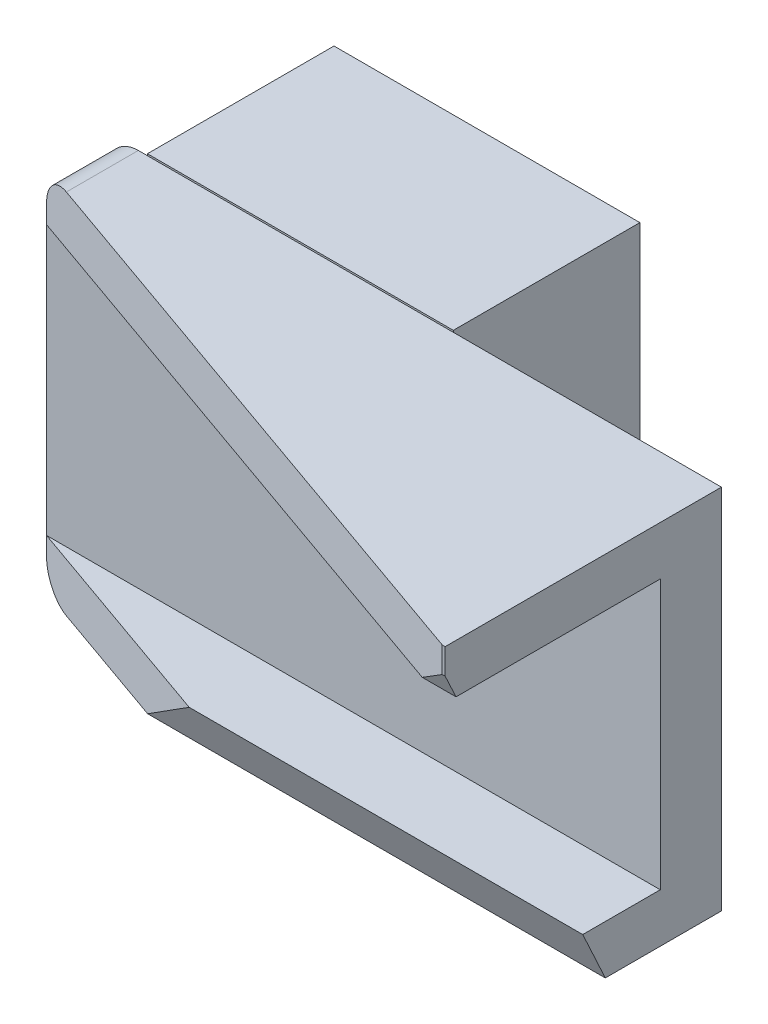
ISO-10303-21;
HEADER;
FILE_DESCRIPTION(('STEP AP214'),'2;1');
FILE_NAME('part.step','',(''),(''),'','','');
FILE_SCHEMA(('AUTOMOTIVE_DESIGN { 1 0 10303 214 1 1 1 1 }'));
ENDSEC;
DATA;
#1=APPLICATION_CONTEXT('core data for automotive mechanical design processes');
#2=APPLICATION_PROTOCOL_DEFINITION('international standard','automotive_design',2000,#1);
#3=PRODUCT_CONTEXT('',#1,'mechanical');
#4=PRODUCT('Part','Part','',(#3));
#5=PRODUCT_RELATED_PRODUCT_CATEGORY('part','',(#4));
#6=PRODUCT_DEFINITION_FORMATION('','',#4);
#7=PRODUCT_DEFINITION_CONTEXT('part definition',#1,'design');
#8=PRODUCT_DEFINITION('design','',#6,#7);
#9=PRODUCT_DEFINITION_SHAPE('','',#8);
#10=(LENGTH_UNIT() NAMED_UNIT(*) SI_UNIT(.MILLI.,.METRE.));
#11=(NAMED_UNIT(*) PLANE_ANGLE_UNIT() SI_UNIT($,.RADIAN.));
#12=(NAMED_UNIT(*) SI_UNIT($,.STERADIAN.) SOLID_ANGLE_UNIT());
#13=UNCERTAINTY_MEASURE_WITH_UNIT(LENGTH_MEASURE(1.E-05),#10,'distance_accuracy_value','');
#14=(GEOMETRIC_REPRESENTATION_CONTEXT(3) GLOBAL_UNCERTAINTY_ASSIGNED_CONTEXT((#13)) GLOBAL_UNIT_ASSIGNED_CONTEXT((#10,
#11,#12)) REPRESENTATION_CONTEXT('',''));
#15=CARTESIAN_POINT('',(0.,0.,0.));
#16=DIRECTION('',(0.,0.,1.));
#17=DIRECTION('',(1.,0.,0.));
#18=AXIS2_PLACEMENT_3D('',#15,#16,#17);
#19=CARTESIAN_POINT('',(144.586036565936,37.2864015562166,16.7084422828931));
#20=DIRECTION('',(0.,0.,-1.));
#21=DIRECTION('',(-1.,0.,0.));
#22=AXIS2_PLACEMENT_3D('',#19,#20,#21);
#23=PLANE('',#22);
#24=DIRECTION('',(-1.,0.,0.));
#25=VECTOR('',#24,1.);
#26=CARTESIAN_POINT('',(138.441970265516,43.2864015562166,16.7084422828931));
#27=LINE('',#26,#25);
#28=CARTESIAN_POINT('',(124.988882205043,43.2864015562166,16.7084422828933));
#29=VERTEX_POINT('',#28);
#30=CARTESIAN_POINT('',(124.840095260788,43.2864015562166,16.7084422828932));
#31=VERTEX_POINT('',#30);
#32=EDGE_CURVE('E68',#29,#31,#27,.T.);
#33=ORIENTED_EDGE('',*,*,#32,.F.);
#34=DIRECTION('',(0.,-1.,0.));
#35=VECTOR('',#34,1.);
#36=CARTESIAN_POINT('',(124.988882205043,43.3146633266082,16.7084422828931));
#37=LINE('',#36,#35);
#38=CARTESIAN_POINT('',(124.988882205043,38.3146633266082,16.7084422828931));
#39=VERTEX_POINT('',#38);
#40=EDGE_CURVE('E11',#29,#39,#37,.T.);
#41=ORIENTED_EDGE('',*,*,#40,.T.);
#42=DIRECTION('',(-1.,0.,0.));
#43=VECTOR('',#42,1.);
#44=CARTESIAN_POINT('',(129.988882205043,38.3146633266082,16.7084422828931));
#45=LINE('',#44,#43);
#46=CARTESIAN_POINT('',(129.988882205043,38.3146633266082,16.7084422828931));
#47=VERTEX_POINT('',#46);
#48=EDGE_CURVE('E192',#47,#39,#45,.T.);
#49=ORIENTED_EDGE('',*,*,#48,.F.);
#50=DIRECTION('',(0.,-1.,0.));
#51=VECTOR('',#50,1.);
#52=CARTESIAN_POINT('',(129.988882205043,43.3146633266082,16.7084422828931));
#53=LINE('',#52,#51);
#54=CARTESIAN_POINT('',(129.988882205043,43.2864015562166,16.7084422828932));
#55=VERTEX_POINT('',#54);
#56=EDGE_CURVE('E56',#55,#47,#53,.T.);
#57=ORIENTED_EDGE('',*,*,#56,.F.);
#58=CARTESIAN_POINT('',(134.371970265516,43.2864015562166,16.7084422828931));
#59=VERTEX_POINT('',#58);
#60=EDGE_CURVE('E250',#59,#55,#27,.T.);
#61=ORIENTED_EDGE('',*,*,#60,.F.);
#62=DIRECTION('',(0.,-1.,0.));
#63=VECTOR('',#62,1.);
#64=CARTESIAN_POINT('',(134.371970265516,43.2864015562166,16.7084422828931));
#65=LINE('',#64,#63);
#66=CARTESIAN_POINT('',(134.371970265516,37.2864015562166,16.7084422828931));
#67=VERTEX_POINT('',#66);
#68=EDGE_CURVE('E221',#59,#67,#65,.T.);
#69=ORIENTED_EDGE('',*,*,#68,.T.);
#70=DIRECTION('',(1.,0.,0.));
#71=VECTOR('',#70,1.);
#72=CARTESIAN_POINT('',(124.840095260788,37.2864015562166,16.7084422828932));
#73=LINE('',#72,#71);
#74=CARTESIAN_POINT('',(124.840095260788,37.2864015562166,16.7084422828932));
#75=VERTEX_POINT('',#74);
#76=EDGE_CURVE('E249',#75,#67,#73,.T.);
#77=ORIENTED_EDGE('',*,*,#76,.F.);
#78=CARTESIAN_POINT('',(124.840095260788,37.7864015562166,16.7084422828932));
#79=DIRECTION('',(0.,0.,1.));
#80=DIRECTION('',(0.,-1.,0.));
#81=AXIS2_PLACEMENT_3D('',#78,#79,#80);
#82=CIRCLE('',#81,0.499999999999989);
#83=CARTESIAN_POINT('',(124.340095260788,37.7864015562166,16.7084422828932));
#84=VERTEX_POINT('',#83);
#85=EDGE_CURVE('E232',#84,#75,#82,.T.);
#86=ORIENTED_EDGE('',*,*,#85,.F.);
#87=DIRECTION('',(0.,-1.,0.));
#88=VECTOR('',#87,1.);
#89=CARTESIAN_POINT('',(124.340095260788,42.7864015562166,16.7084422828932));
#90=LINE('',#89,#88);
#91=CARTESIAN_POINT('',(124.340095260788,42.7864015562166,16.7084422828932));
#92=VERTEX_POINT('',#91);
#93=EDGE_CURVE('E236',#92,#84,#90,.T.);
#94=ORIENTED_EDGE('',*,*,#93,.F.);
#95=CARTESIAN_POINT('',(124.840095260788,42.7864015562166,16.7084422828932));
#96=DIRECTION('',(0.,0.,1.));
#97=DIRECTION('',(-1.,0.,0.));
#98=AXIS2_PLACEMENT_3D('',#95,#96,#97);
#99=CIRCLE('',#98,0.499999999999989);
#100=EDGE_CURVE('E266',#31,#92,#99,.T.);
#101=ORIENTED_EDGE('',*,*,#100,.F.);
#102=EDGE_LOOP('',(#33,#41,#49,#57,#61,#69,#77,#86,#94,#101));
#103=FACE_BOUND('',#102,.T.);
#104=ADVANCED_FACE('F46',(#103),#23,.T.);
#105=CARTESIAN_POINT('',(124.840095260788,37.7864015562165,17.8845292394135));
#106=DIRECTION('',(0.,0.,1.));
#107=DIRECTION('',(-0.707106781186548,-0.707106781186548,0.));
#108=AXIS2_PLACEMENT_3D('',#105,#106,#107);
#109=CYLINDRICAL_SURFACE('',#108,0.499999999999899);
#110=DIRECTION('',(0.,0.,1.));
#111=VECTOR('',#110,1.);
#112=CARTESIAN_POINT('',(124.340095260788,37.7864015562166,16.7084422828932));
#113=LINE('',#112,#111);
#114=CARTESIAN_POINT('',(124.340095260788,37.7864015562166,17.7084422828931));
#115=VERTEX_POINT('',#114);
#116=EDGE_CURVE('E239',#84,#115,#113,.T.);
#117=ORIENTED_EDGE('',*,*,#116,.F.);
#118=ORIENTED_EDGE('',*,*,#85,.T.);
#119=DIRECTION('',(0.,0.,1.));
#120=VECTOR('',#119,1.);
#121=CARTESIAN_POINT('',(124.840095260788,37.2864015562166,16.7084422828932));
#122=LINE('',#121,#120);
#123=CARTESIAN_POINT('',(124.840095260788,37.2864015562166,17.8845292394136));
#124=VERTEX_POINT('',#123);
#125=EDGE_CURVE('E235',#75,#124,#122,.T.);
#126=ORIENTED_EDGE('',*,*,#125,.T.);
#127=CARTESIAN_POINT('',(124.840095260788,37.7864015562165,17.8845292394149));
#128=DIRECTION('',(0.33217650739941,0.,-0.943217243232931));
#129=DIRECTION('',(-0.943217243232931,0.,-0.33217650739941));
#130=AXIS2_PLACEMENT_3D('',#127,#128,#129);
#131=ELLIPSE('',#130,0.530100571832338,0.499999999999899);
#132=EDGE_CURVE('E260',#124,#115,#131,.T.);
#133=ORIENTED_EDGE('',*,*,#132,.T.);
#134=EDGE_LOOP('',(#117,#118,#126,#133));
#135=FACE_BOUND('',#134,.T.);
#136=ADVANCED_FACE('F355',(#135),#109,.T.);
#137=CARTESIAN_POINT('',(124.340095260788,42.7864015562166,17.7084422828931));
#138=DIRECTION('',(-1.,0.,0.));
#139=DIRECTION('',(0.,1.,0.));
#140=AXIS2_PLACEMENT_3D('',#137,#138,#139);
#141=PLANE('',#140);
#142=DIRECTION('',(0.,1.,0.));
#143=VECTOR('',#142,1.);
#144=CARTESIAN_POINT('',(124.340095260788,42.4864015562166,17.7084422828931));
#145=LINE('',#144,#143);
#146=CARTESIAN_POINT('',(124.340095260788,42.4864015562166,17.7084422828931));
#147=VERTEX_POINT('',#146);
#148=CARTESIAN_POINT('',(124.340095260788,42.7864015562166,17.7084422828931));
#149=VERTEX_POINT('',#148);
#150=EDGE_CURVE('E240',#147,#149,#145,.T.);
#151=ORIENTED_EDGE('',*,*,#150,.T.);
#152=DIRECTION('',(0.,0.,1.));
#153=VECTOR('',#152,1.);
#154=CARTESIAN_POINT('',(124.340095260788,42.7864015562166,16.7084422828932));
#155=LINE('',#154,#153);
#156=EDGE_CURVE('E257',#92,#149,#155,.T.);
#157=ORIENTED_EDGE('',*,*,#156,.F.);
#158=ORIENTED_EDGE('',*,*,#93,.T.);
#159=ORIENTED_EDGE('',*,*,#116,.T.);
#160=DIRECTION('',(0.,1.,0.));
#161=VECTOR('',#160,1.);
#162=CARTESIAN_POINT('',(124.340095260788,37.7864015562166,17.7084422828931));
#163=LINE('',#162,#161);
#164=CARTESIAN_POINT('',(124.340095260788,38.0864015562166,17.7084422828931));
#165=VERTEX_POINT('',#164);
#166=EDGE_CURVE('E241',#115,#165,#163,.T.);
#167=ORIENTED_EDGE('',*,*,#166,.T.);
#168=DIRECTION('',(0.,1.,0.));
#169=VECTOR('',#168,1.);
#170=CARTESIAN_POINT('',(124.340095260788,38.0864015562166,17.7084422828931));
#171=LINE('',#170,#169);
#172=EDGE_CURVE('E244',#165,#147,#171,.T.);
#173=ORIENTED_EDGE('',*,*,#172,.T.);
#174=EDGE_LOOP('',(#151,#157,#158,#159,#167,#173));
#175=FACE_BOUND('',#174,.T.);
#176=ADVANCED_FACE('F328',(#175),#141,.T.);
#177=CARTESIAN_POINT('',(124.840095260788,42.7864015562167,16.7084422828931));
#178=DIRECTION('',(0.,0.,-1.));
#179=DIRECTION('',(-0.70710678118653,0.707106781186565,0.));
#180=AXIS2_PLACEMENT_3D('',#177,#178,#179);
#181=CYLINDRICAL_SURFACE('',#180,0.499999999999861);
#182=ORIENTED_EDGE('',*,*,#156,.T.);
#183=CARTESIAN_POINT('',(124.840095260788,42.7864015562167,17.8845292394148));
#184=DIRECTION('',(0.332176507399409,0.,-0.943217243232931));
#185=DIRECTION('',(-0.943217243232931,0.,-0.332176507399409));
#186=AXIS2_PLACEMENT_3D('',#183,#184,#185);
#187=ELLIPSE('',#186,0.530100571832307,0.499999999999861);
#188=CARTESIAN_POINT('',(124.840095260788,43.2864015562166,17.8845292394137));
#189=VERTEX_POINT('',#188);
#190=EDGE_CURVE('E254',#149,#189,#187,.T.);
#191=ORIENTED_EDGE('',*,*,#190,.T.);
#192=DIRECTION('',(1.81247500064691E-13,0.,-1.));
#193=VECTOR('',#192,1.);
#194=CARTESIAN_POINT('',(124.840095260788,43.2864015562166,17.8845292394137));
#195=LINE('',#194,#193);
#196=EDGE_CURVE('E256',#189,#31,#195,.T.);
#197=ORIENTED_EDGE('',*,*,#196,.T.);
#198=ORIENTED_EDGE('',*,*,#100,.T.);
#199=EDGE_LOOP('',(#182,#191,#197,#198));
#200=FACE_BOUND('',#199,.T.);
#201=ADVANCED_FACE('F322',(#200),#181,.T.);
#202=CARTESIAN_POINT('',(134.322526777958,38.0864015562166,21.2239942519833));
#203=DIRECTION('',(-0.33217650739941,0.,0.943217243232931));
#204=DIRECTION('',(0.,1.,0.));
#205=AXIS2_PLACEMENT_3D('',#202,#203,#204);
#206=PLANE('',#205);
#207=CARTESIAN_POINT('',(913.446496316943,-89.9771736995021,295.611131350484));
#208=DIRECTION('',(-0.33217650739941,0.,0.943217243232931));
#209=DIRECTION('',(0.943217243232931,0.,0.33217650739941));
#210=AXIS2_PLACEMENT_3D('',#207,#208,#209);
#211=ELLIPSE('',#210,917.704594987183,304.839907187232);
#212=CARTESIAN_POINT('',(127.938851772653,38.0864015562141,18.9758304457662));
#213=VERTEX_POINT('',#212);
#214=CARTESIAN_POINT('',(126.891234381749,37.2864015562144,18.6068869298384));
#215=VERTEX_POINT('',#214);
#216=EDGE_CURVE('E212',#213,#215,#211,.T.);
#217=ORIENTED_EDGE('',*,*,#216,.F.);
#218=DIRECTION('',(-0.943217243232934,0.,-0.3321765073994));
#219=VECTOR('',#218,1.);
#220=CARTESIAN_POINT('',(134.322526777958,38.0864015562166,21.2239942519832));
#221=LINE('',#220,#219);
#222=EDGE_CURVE('E270',#213,#165,#221,.T.);
#223=ORIENTED_EDGE('',*,*,#222,.T.);
#224=ORIENTED_EDGE('',*,*,#166,.F.);
#225=ORIENTED_EDGE('',*,*,#132,.F.);
#226=DIRECTION('',(0.943217243232895,0.,0.332176507399512));
#227=VECTOR('',#226,1.);
#228=CARTESIAN_POINT('',(124.840095260788,37.2864015562166,17.8845292394136));
#229=LINE('',#228,#227);
#230=EDGE_CURVE('E269',#124,#215,#229,.T.);
#231=ORIENTED_EDGE('',*,*,#230,.T.);
#232=EDGE_LOOP('',(#217,#223,#224,#225,#231));
#233=FACE_BOUND('',#232,.T.);
#234=ADVANCED_FACE('F353',(#233),#206,.T.);
#235=CARTESIAN_POINT('',(134.322526777958,43.2864015562166,21.2239942519833));
#236=DIRECTION('',(-0.33217650739941,0.,0.943217243232931));
#237=DIRECTION('',(0.,1.,0.));
#238=AXIS2_PLACEMENT_3D('',#235,#236,#237);
#239=PLANE('',#238);
#240=DIRECTION('',(0.943217243232936,0.,0.332176507399396));
#241=VECTOR('',#240,1.);
#242=CARTESIAN_POINT('',(124.340095260788,42.4864015562166,17.7084422828931));
#243=LINE('',#242,#241);
#244=CARTESIAN_POINT('',(133.819375057924,42.4864015562166,21.0467973418842));
#245=VERTEX_POINT('',#244);
#246=EDGE_CURVE('E265',#147,#245,#243,.T.);
#247=ORIENTED_EDGE('',*,*,#246,.T.);
#248=DIRECTION('',(-0.768228406220149,-0.580196355771124,-0.270550003929694));
#249=VECTOR('',#248,1.);
#250=CARTESIAN_POINT('',(134.509730573067,43.0077852369419,21.2899225450435));
#251=LINE('',#250,#249);
#252=CARTESIAN_POINT('',(134.322526777958,42.8664015562166,21.2239942519831));
#253=VERTEX_POINT('',#252);
#254=EDGE_CURVE('E296',#245,#253,#251,.F.);
#255=ORIENTED_EDGE('',*,*,#254,.T.);
#256=DIRECTION('',(0.,1.,0.));
#257=VECTOR('',#256,1.);
#258=CARTESIAN_POINT('',(134.322526777958,42.4864015562166,21.2239942519831));
#259=LINE('',#258,#257);
#260=CARTESIAN_POINT('',(134.322526777958,43.2864015562166,21.2239942519831));
#261=VERTEX_POINT('',#260);
#262=EDGE_CURVE('E261',#253,#261,#259,.T.);
#263=ORIENTED_EDGE('',*,*,#262,.T.);
#264=DIRECTION('',(-0.943217243232901,0.,-0.332176507399496));
#265=VECTOR('',#264,1.);
#266=CARTESIAN_POINT('',(134.322526777958,43.2864015562166,21.2239942519831));
#267=LINE('',#266,#265);
#268=EDGE_CURVE('E264',#261,#189,#267,.T.);
#269=ORIENTED_EDGE('',*,*,#268,.T.);
#270=ORIENTED_EDGE('',*,*,#190,.F.);
#271=ORIENTED_EDGE('',*,*,#150,.F.);
#272=EDGE_LOOP('',(#247,#255,#263,#269,#270,#271));
#273=FACE_BOUND('',#272,.T.);
#274=ADVANCED_FACE('F331',(#273),#239,.T.);
#275=CARTESIAN_POINT('',(144.586036565936,42.4864015562166,21.2239942519831));
#276=DIRECTION('',(0.,-1.,0.));
#277=DIRECTION('',(0.,0.,-1.));
#278=AXIS2_PLACEMENT_3D('',#275,#276,#277);
#279=PLANE('',#278);
#280=DIRECTION('',(0.,0.,-1.));
#281=VECTOR('',#280,1.);
#282=CARTESIAN_POINT('',(134.371970265516,42.4864015562166,21.2239942519831));
#283=LINE('',#282,#281);
#284=CARTESIAN_POINT('',(134.371970265516,42.4864015562166,21.0467973418842));
#285=VERTEX_POINT('',#284);
#286=CARTESIAN_POINT('',(134.371970265516,42.4864015562166,17.7084422828931));
#287=VERTEX_POINT('',#286);
#288=EDGE_CURVE('E224',#285,#287,#283,.T.);
#289=ORIENTED_EDGE('',*,*,#288,.F.);
#290=DIRECTION('',(-1.,0.,0.));
#291=VECTOR('',#290,1.);
#292=CARTESIAN_POINT('',(144.586036565936,42.4864015562166,21.0467973418842));
#293=LINE('',#292,#291);
#294=EDGE_CURVE('E248',#285,#245,#293,.T.);
#295=ORIENTED_EDGE('',*,*,#294,.T.);
#296=ORIENTED_EDGE('',*,*,#246,.F.);
#297=DIRECTION('',(1.,0.,0.));
#298=VECTOR('',#297,1.);
#299=CARTESIAN_POINT('',(124.340095260788,42.4864015562166,17.7084422828931));
#300=LINE('',#299,#298);
#301=EDGE_CURVE('E286',#147,#287,#300,.T.);
#302=ORIENTED_EDGE('',*,*,#301,.T.);
#303=EDGE_LOOP('',(#289,#295,#296,#302));
#304=FACE_BOUND('',#303,.T.);
#305=ADVANCED_FACE('F340',(#304),#279,.T.);
#306=CARTESIAN_POINT('',(144.586036565936,43.2864015562166,21.2239942519831));
#307=DIRECTION('',(0.,0.,1.));
#308=DIRECTION('',(1.,0.,0.));
#309=AXIS2_PLACEMENT_3D('',#306,#307,#308);
#310=PLANE('',#309);
#311=DIRECTION('',(0.,-1.,0.));
#312=VECTOR('',#311,1.);
#313=CARTESIAN_POINT('',(134.371970265516,43.2864015562166,21.2239942519831));
#314=LINE('',#313,#312);
#315=CARTESIAN_POINT('',(134.371970265516,43.2864015562166,21.2239942519831));
#316=VERTEX_POINT('',#315);
#317=CARTESIAN_POINT('',(134.371970265516,42.8664015562166,21.2239942519831));
#318=VERTEX_POINT('',#317);
#319=EDGE_CURVE('E219',#316,#318,#314,.T.);
#320=ORIENTED_EDGE('',*,*,#319,.F.);
#321=DIRECTION('',(-1.,0.,0.));
#322=VECTOR('',#321,1.);
#323=CARTESIAN_POINT('',(138.441970265516,43.2864015562166,21.2239942519831));
#324=LINE('',#323,#322);
#325=EDGE_CURVE('E284',#316,#261,#324,.T.);
#326=ORIENTED_EDGE('',*,*,#325,.T.);
#327=ORIENTED_EDGE('',*,*,#262,.F.);
#328=DIRECTION('',(1.,0.,0.));
#329=VECTOR('',#328,1.);
#330=CARTESIAN_POINT('',(144.586036565936,42.8664015562166,21.2239942519831));
#331=LINE('',#330,#329);
#332=EDGE_CURVE('E297',#253,#318,#331,.T.);
#333=ORIENTED_EDGE('',*,*,#332,.T.);
#334=EDGE_LOOP('',(#320,#326,#327,#333));
#335=FACE_BOUND('',#334,.T.);
#336=ADVANCED_FACE('F334',(#335),#310,.T.);
#337=CARTESIAN_POINT('',(144.586036565936,43.2864015562166,16.7084422828931));
#338=DIRECTION('',(0.,1.,0.));
#339=DIRECTION('',(1.,0.,0.));
#340=AXIS2_PLACEMENT_3D('',#337,#338,#339);
#341=PLANE('',#340);
#342=DIRECTION('',(0.,0.,-1.));
#343=VECTOR('',#342,1.);
#344=CARTESIAN_POINT('',(134.371970265516,43.2864015562166,21.2239942519831));
#345=LINE('',#344,#343);
#346=EDGE_CURVE('E216',#316,#59,#345,.T.);
#347=ORIENTED_EDGE('',*,*,#346,.T.);
#348=ORIENTED_EDGE('',*,*,#60,.T.);
#349=EDGE_CURVE('E253',#55,#29,#27,.T.);
#350=ORIENTED_EDGE('',*,*,#349,.T.);
#351=ORIENTED_EDGE('',*,*,#32,.T.);
#352=ORIENTED_EDGE('',*,*,#196,.F.);
#353=ORIENTED_EDGE('',*,*,#268,.F.);
#354=ORIENTED_EDGE('',*,*,#325,.F.);
#355=EDGE_LOOP('',(#347,#348,#350,#351,#352,#353,#354));
#356=FACE_BOUND('',#355,.T.);
#357=ADVANCED_FACE('F319',(#356),#341,.T.);
#358=CARTESIAN_POINT('',(144.586036565936,37.2864015562166,21.2239942519831));
#359=DIRECTION('',(0.,-1.,0.));
#360=DIRECTION('',(0.,0.,-1.));
#361=AXIS2_PLACEMENT_3D('',#358,#359,#360);
#362=PLANE('',#361);
#363=DIRECTION('',(1.,0.,0.));
#364=VECTOR('',#363,1.);
#365=CARTESIAN_POINT('',(124.340095260788,37.2864015562144,18.6068869298384));
#366=LINE('',#365,#364);
#367=CARTESIAN_POINT('',(134.371970265516,37.2864015562166,18.6068869298384));
#368=VERTEX_POINT('',#367);
#369=EDGE_CURVE('E208',#215,#368,#366,.T.);
#370=ORIENTED_EDGE('',*,*,#369,.F.);
#371=ORIENTED_EDGE('',*,*,#230,.F.);
#372=ORIENTED_EDGE('',*,*,#125,.F.);
#373=ORIENTED_EDGE('',*,*,#76,.T.);
#374=DIRECTION('',(0.,0.,-1.));
#375=VECTOR('',#374,1.);
#376=CARTESIAN_POINT('',(134.371970265516,37.2864015562166,21.2239942519831));
#377=LINE('',#376,#375);
#378=EDGE_CURVE('E215',#368,#67,#377,.T.);
#379=ORIENTED_EDGE('',*,*,#378,.F.);
#380=EDGE_LOOP('',(#370,#371,#372,#373,#379));
#381=FACE_BOUND('',#380,.T.);
#382=ADVANCED_FACE('F359',(#381),#362,.T.);
#383=CARTESIAN_POINT('',(144.586036565936,38.0864015562166,17.7084422828931));
#384=DIRECTION('',(0.,1.,0.));
#385=DIRECTION('',(1.,0.,0.));
#386=AXIS2_PLACEMENT_3D('',#383,#384,#385);
#387=PLANE('',#386);
#388=DIRECTION('',(1.,0.,0.));
#389=VECTOR('',#388,1.);
#390=CARTESIAN_POINT('',(124.340095260788,38.0864015562141,18.9758304457662));
#391=LINE('',#390,#389);
#392=CARTESIAN_POINT('',(134.371970265516,38.0864015562141,18.9758304457662));
#393=VERTEX_POINT('',#392);
#394=EDGE_CURVE('E209',#213,#393,#391,.T.);
#395=ORIENTED_EDGE('',*,*,#394,.T.);
#396=DIRECTION('',(0.,0.,1.));
#397=VECTOR('',#396,1.);
#398=CARTESIAN_POINT('',(134.371970265516,38.0864015562166,17.7084422828931));
#399=LINE('',#398,#397);
#400=CARTESIAN_POINT('',(134.371970265516,38.0864015562166,17.7084422828931));
#401=VERTEX_POINT('',#400);
#402=EDGE_CURVE('E229',#401,#393,#399,.T.);
#403=ORIENTED_EDGE('',*,*,#402,.F.);
#404=DIRECTION('',(-1.,0.,0.));
#405=VECTOR('',#404,1.);
#406=CARTESIAN_POINT('',(138.441970265516,38.0864015562166,17.7084422828931));
#407=LINE('',#406,#405);
#408=EDGE_CURVE('E245',#401,#165,#407,.T.);
#409=ORIENTED_EDGE('',*,*,#408,.T.);
#410=ORIENTED_EDGE('',*,*,#222,.F.);
#411=EDGE_LOOP('',(#395,#403,#409,#410));
#412=FACE_BOUND('',#411,.T.);
#413=ADVANCED_FACE('F350',(#412),#387,.T.);
#414=CARTESIAN_POINT('',(144.586036565936,42.4864015562166,17.7084422828931));
#415=DIRECTION('',(0.,0.,1.));
#416=DIRECTION('',(1.,0.,0.));
#417=AXIS2_PLACEMENT_3D('',#414,#415,#416);
#418=PLANE('',#417);
#419=DIRECTION('',(0.,-1.,0.));
#420=VECTOR('',#419,1.);
#421=CARTESIAN_POINT('',(134.371970265516,42.4864015562166,17.7084422828931));
#422=LINE('',#421,#420);
#423=EDGE_CURVE('E227',#287,#401,#422,.T.);
#424=ORIENTED_EDGE('',*,*,#423,.F.);
#425=ORIENTED_EDGE('',*,*,#301,.F.);
#426=ORIENTED_EDGE('',*,*,#172,.F.);
#427=ORIENTED_EDGE('',*,*,#408,.F.);
#428=EDGE_LOOP('',(#424,#425,#426,#427));
#429=FACE_BOUND('',#428,.T.);
#430=ADVANCED_FACE('F346',(#429),#418,.T.);
#431=CARTESIAN_POINT('',(144.586036565936,42.4864015562166,21.0467973418842));
#432=DIRECTION('',(0.,0.422618261740696,-0.906307787036651));
#433=DIRECTION('',(-1.,0.,0.));
#434=AXIS2_PLACEMENT_3D('',#431,#432,#433);
#435=PLANE('',#434);
#436=DIRECTION('',(0.,0.906307787036651,0.422618261740697));
#437=VECTOR('',#436,1.);
#438=CARTESIAN_POINT('',(134.371970265516,42.4864015562166,21.0467973418842));
#439=LINE('',#438,#437);
#440=EDGE_CURVE('E51',#318,#285,#439,.F.);
#441=ORIENTED_EDGE('',*,*,#440,.F.);
#442=ORIENTED_EDGE('',*,*,#332,.F.);
#443=ORIENTED_EDGE('',*,*,#254,.F.);
#444=ORIENTED_EDGE('',*,*,#294,.F.);
#445=EDGE_LOOP('',(#441,#442,#443,#444));
#446=FACE_BOUND('',#445,.T.);
#447=ADVANCED_FACE('F49',(#446),#435,.F.);
#448=CARTESIAN_POINT('',(134.371970265516,43.2864015562166,21.2239942519831));
#449=DIRECTION('',(-1.,0.,0.));
#450=DIRECTION('',(0.,-1.,0.));
#451=AXIS2_PLACEMENT_3D('',#448,#449,#450);
#452=PLANE('',#451);
#453=ORIENTED_EDGE('',*,*,#402,.T.);
#454=CARTESIAN_POINT('',(134.371970265516,-89.9771736995024,295.611131350484));
#455=DIRECTION('',(1.,0.,0.));
#456=DIRECTION('',(0.,1.,0.));
#457=AXIS2_PLACEMENT_3D('',#454,#455,#456);
#458=CIRCLE('',#457,304.839907187232);
#459=EDGE_CURVE('E202',#368,#393,#458,.T.);
#460=ORIENTED_EDGE('',*,*,#459,.F.);
#461=ORIENTED_EDGE('',*,*,#378,.T.);
#462=ORIENTED_EDGE('',*,*,#68,.F.);
#463=ORIENTED_EDGE('',*,*,#346,.F.);
#464=ORIENTED_EDGE('',*,*,#319,.T.);
#465=ORIENTED_EDGE('',*,*,#440,.T.);
#466=ORIENTED_EDGE('',*,*,#288,.T.);
#467=ORIENTED_EDGE('',*,*,#423,.T.);
#468=EDGE_LOOP('',(#453,#460,#461,#462,#463,#464,#465,#466,#467));
#469=FACE_BOUND('',#468,.T.);
#470=ADVANCED_FACE('F335',(#469),#452,.F.);
#471=CARTESIAN_POINT('',(124.340095260788,-89.9771736995024,295.611131350484));
#472=DIRECTION('',(1.,0.,0.));
#473=DIRECTION('',(0.,1.,0.));
#474=AXIS2_PLACEMENT_3D('',#471,#472,#473);
#475=CYLINDRICAL_SURFACE('',#474,304.839907187232);
#476=ORIENTED_EDGE('',*,*,#216,.T.);
#477=ORIENTED_EDGE('',*,*,#369,.T.);
#478=ORIENTED_EDGE('',*,*,#459,.T.);
#479=ORIENTED_EDGE('',*,*,#394,.F.);
#480=EDGE_LOOP('',(#476,#477,#478,#479));
#481=FACE_BOUND('',#480,.T.);
#482=ADVANCED_FACE('F362',(#481),#475,.F.);
#483=CARTESIAN_POINT('',(0.,0.,16.7084422828933));
#484=DIRECTION('',(0.,0.,1.));
#485=DIRECTION('',(1.,0.,0.));
#486=AXIS2_PLACEMENT_3D('',#483,#484,#485);
#487=PLANE('',#486);
#488=ORIENTED_EDGE('',*,*,#349,.F.);
#489=CARTESIAN_POINT('',(129.988882205043,43.3146633266082,16.7084422828931));
#490=VERTEX_POINT('',#489);
#491=EDGE_CURVE('E189',#490,#55,#53,.T.);
#492=ORIENTED_EDGE('',*,*,#491,.F.);
#493=DIRECTION('',(-1.,0.,0.));
#494=VECTOR('',#493,1.);
#495=CARTESIAN_POINT('',(129.988882205043,43.3146633266082,16.7084422828931));
#496=LINE('',#495,#494);
#497=CARTESIAN_POINT('',(124.988882205043,43.3146633266082,16.7084422828931));
#498=VERTEX_POINT('',#497);
#499=EDGE_CURVE('E197',#490,#498,#496,.T.);
#500=ORIENTED_EDGE('',*,*,#499,.T.);
#501=EDGE_CURVE('E58',#498,#29,#37,.T.);
#502=ORIENTED_EDGE('',*,*,#501,.T.);
#503=EDGE_LOOP('',(#488,#492,#500,#502));
#504=FACE_BOUND('',#503,.T.);
#505=ADVANCED_FACE('F316',(#504),#487,.T.);
#506=CARTESIAN_POINT('',(129.988882205043,43.3146633266082,13.6584422828931));
#507=DIRECTION('',(0.,1.,0.));
#508=DIRECTION('',(-1.,0.,0.));
#509=AXIS2_PLACEMENT_3D('',#506,#507,#508);
#510=PLANE('',#509);
#511=ORIENTED_EDGE('',*,*,#499,.F.);
#512=DIRECTION('',(0.,0.,1.));
#513=VECTOR('',#512,1.);
#514=CARTESIAN_POINT('',(129.988882205043,43.3146633266082,13.6584422828931));
#515=LINE('',#514,#513);
#516=CARTESIAN_POINT('',(129.988882205043,43.3146633266082,13.6584422828931));
#517=VERTEX_POINT('',#516);
#518=EDGE_CURVE('E187',#517,#490,#515,.T.);
#519=ORIENTED_EDGE('',*,*,#518,.F.);
#520=DIRECTION('',(-1.,0.,0.));
#521=VECTOR('',#520,1.);
#522=CARTESIAN_POINT('',(129.988882205043,43.3146633266082,13.6584422828931));
#523=LINE('',#522,#521);
#524=CARTESIAN_POINT('',(124.988882205043,43.3146633266082,13.6584422828931));
#525=VERTEX_POINT('',#524);
#526=EDGE_CURVE('E181',#517,#525,#523,.T.);
#527=ORIENTED_EDGE('',*,*,#526,.T.);
#528=DIRECTION('',(0.,0.,1.));
#529=VECTOR('',#528,1.);
#530=CARTESIAN_POINT('',(124.988882205043,43.3146633266082,13.6584422828931));
#531=LINE('',#530,#529);
#532=EDGE_CURVE('E166',#525,#498,#531,.T.);
#533=ORIENTED_EDGE('',*,*,#532,.T.);
#534=EDGE_LOOP('',(#511,#519,#527,#533));
#535=FACE_BOUND('',#534,.T.);
#536=ADVANCED_FACE('F186',(#535),#510,.T.);
#537=CARTESIAN_POINT('',(129.988882205043,43.3146633266082,13.6584422828931));
#538=DIRECTION('',(-1.,0.,0.));
#539=DIRECTION('',(0.,0.,1.));
#540=AXIS2_PLACEMENT_3D('',#537,#538,#539);
#541=PLANE('',#540);
#542=ORIENTED_EDGE('',*,*,#491,.T.);
#543=ORIENTED_EDGE('',*,*,#56,.T.);
#544=DIRECTION('',(0.,0.,1.));
#545=VECTOR('',#544,1.);
#546=CARTESIAN_POINT('',(129.988882205043,38.3146633266082,13.6584422828931));
#547=LINE('',#546,#545);
#548=CARTESIAN_POINT('',(129.988882205043,38.3146633266082,13.6584422828931));
#549=VERTEX_POINT('',#548);
#550=EDGE_CURVE('E203',#549,#47,#547,.T.);
#551=ORIENTED_EDGE('',*,*,#550,.F.);
#552=DIRECTION('',(0.,-1.,0.));
#553=VECTOR('',#552,1.);
#554=CARTESIAN_POINT('',(129.988882205043,43.3146633266082,13.6584422828931));
#555=LINE('',#554,#553);
#556=EDGE_CURVE('E176',#517,#549,#555,.T.);
#557=ORIENTED_EDGE('',*,*,#556,.F.);
#558=ORIENTED_EDGE('',*,*,#518,.T.);
#559=EDGE_LOOP('',(#542,#543,#551,#557,#558));
#560=FACE_BOUND('',#559,.T.);
#561=ADVANCED_FACE('F309',(#560),#541,.F.);
#562=CARTESIAN_POINT('',(129.988882205043,38.3146633266082,13.6584422828931));
#563=DIRECTION('',(0.,1.,0.));
#564=DIRECTION('',(0.,0.,1.));
#565=AXIS2_PLACEMENT_3D('',#562,#563,#564);
#566=PLANE('',#565);
#567=ORIENTED_EDGE('',*,*,#48,.T.);
#568=DIRECTION('',(0.,0.,1.));
#569=VECTOR('',#568,1.);
#570=CARTESIAN_POINT('',(124.988882205043,38.3146633266082,13.6584422828931));
#571=LINE('',#570,#569);
#572=CARTESIAN_POINT('',(124.988882205043,38.3146633266082,13.6584422828931));
#573=VERTEX_POINT('',#572);
#574=EDGE_CURVE('E175',#573,#39,#571,.T.);
#575=ORIENTED_EDGE('',*,*,#574,.F.);
#576=DIRECTION('',(-1.,0.,0.));
#577=VECTOR('',#576,1.);
#578=CARTESIAN_POINT('',(129.988882205043,38.3146633266082,13.6584422828931));
#579=LINE('',#578,#577);
#580=EDGE_CURVE('E183',#549,#573,#579,.T.);
#581=ORIENTED_EDGE('',*,*,#580,.F.);
#582=ORIENTED_EDGE('',*,*,#550,.T.);
#583=EDGE_LOOP('',(#567,#575,#581,#582));
#584=FACE_BOUND('',#583,.T.);
#585=ADVANCED_FACE('F313',(#584),#566,.F.);
#586=CARTESIAN_POINT('',(124.988882205043,43.3146633266082,13.6584422828931));
#587=DIRECTION('',(-1.,0.,0.));
#588=DIRECTION('',(0.,0.,1.));
#589=AXIS2_PLACEMENT_3D('',#586,#587,#588);
#590=PLANE('',#589);
#591=ORIENTED_EDGE('',*,*,#501,.F.);
#592=ORIENTED_EDGE('',*,*,#532,.F.);
#593=DIRECTION('',(0.,-1.,0.));
#594=VECTOR('',#593,1.);
#595=CARTESIAN_POINT('',(124.988882205043,43.3146633266082,13.6584422828931));
#596=LINE('',#595,#594);
#597=EDGE_CURVE('E169',#525,#573,#596,.T.);
#598=ORIENTED_EDGE('',*,*,#597,.T.);
#599=ORIENTED_EDGE('',*,*,#574,.T.);
#600=ORIENTED_EDGE('',*,*,#40,.F.);
#601=EDGE_LOOP('',(#591,#592,#598,#599,#600));
#602=FACE_BOUND('',#601,.T.);
#603=ADVANCED_FACE('F168',(#602),#590,.T.);
#604=CARTESIAN_POINT('',(0.,0.,13.6584422828933));
#605=DIRECTION('',(0.,0.,1.));
#606=DIRECTION('',(1.,0.,0.));
#607=AXIS2_PLACEMENT_3D('',#604,#605,#606);
#608=PLANE('',#607);
#609=ORIENTED_EDGE('',*,*,#526,.F.);
#610=ORIENTED_EDGE('',*,*,#556,.T.);
#611=ORIENTED_EDGE('',*,*,#580,.T.);
#612=ORIENTED_EDGE('',*,*,#597,.F.);
#613=EDGE_LOOP('',(#609,#610,#611,#612));
#614=FACE_BOUND('',#613,.T.);
#615=ADVANCED_FACE('F180',(#614),#608,.F.);
#616=CLOSED_SHELL('',(#104,#136,#176,#201,#234,#274,#305,#336,#357,#382,#413,#430,#447,#470,
#482,#505,#536,#561,#585,#603,#615));
#617=MANIFOLD_SOLID_BREP('B2',#616);
#618=ADVANCED_BREP_SHAPE_REPRESENTATION('',(#18,#617),#14);
#619=SHAPE_DEFINITION_REPRESENTATION(#9,#618);
ENDSEC;
END-ISO-10303-21;
